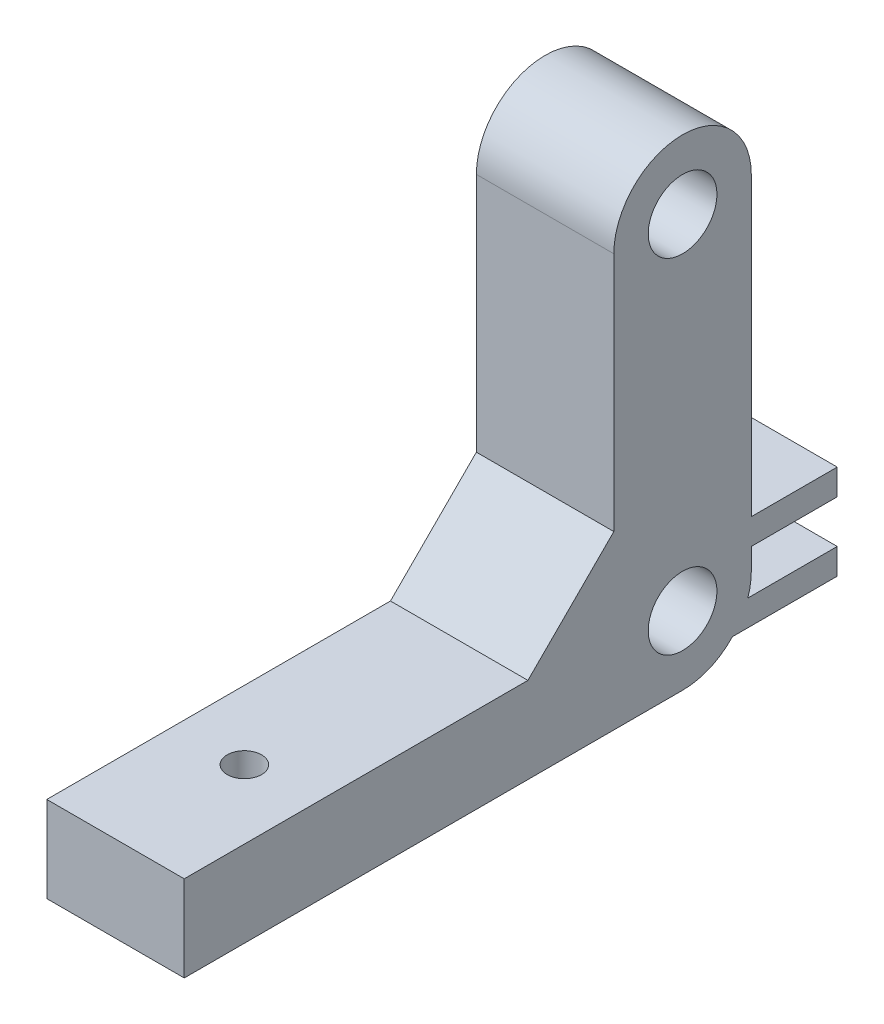
ISO-10303-21;
HEADER;
FILE_DESCRIPTION(('STEP AP214'),'2;1');
FILE_NAME('part.step','',(''),(''),'','','');
FILE_SCHEMA(('AUTOMOTIVE_DESIGN { 1 0 10303 214 1 1 1 1 }'));
ENDSEC;
DATA;
#1=APPLICATION_CONTEXT('core data for automotive mechanical design processes');
#2=APPLICATION_PROTOCOL_DEFINITION('international standard','automotive_design',2000,#1);
#3=PRODUCT_CONTEXT('',#1,'mechanical');
#4=PRODUCT('Part','Part','',(#3));
#5=PRODUCT_RELATED_PRODUCT_CATEGORY('part','',(#4));
#6=PRODUCT_DEFINITION_FORMATION('','',#4);
#7=PRODUCT_DEFINITION_CONTEXT('part definition',#1,'design');
#8=PRODUCT_DEFINITION('design','',#6,#7);
#9=PRODUCT_DEFINITION_SHAPE('','',#8);
#10=(LENGTH_UNIT() NAMED_UNIT(*) SI_UNIT(.MILLI.,.METRE.));
#11=(NAMED_UNIT(*) PLANE_ANGLE_UNIT() SI_UNIT($,.RADIAN.));
#12=(NAMED_UNIT(*) SI_UNIT($,.STERADIAN.) SOLID_ANGLE_UNIT());
#13=UNCERTAINTY_MEASURE_WITH_UNIT(LENGTH_MEASURE(1.E-05),#10,'distance_accuracy_value','');
#14=(GEOMETRIC_REPRESENTATION_CONTEXT(3) GLOBAL_UNCERTAINTY_ASSIGNED_CONTEXT((#13)) GLOBAL_UNIT_ASSIGNED_CONTEXT((#10,
#11,#12)) REPRESENTATION_CONTEXT('',''));
#15=CARTESIAN_POINT('',(0.,0.,0.));
#16=DIRECTION('',(0.,0.,1.));
#17=DIRECTION('',(1.,0.,0.));
#18=AXIS2_PLACEMENT_3D('',#15,#16,#17);
#19=CARTESIAN_POINT('',(-16.,-50.7898519823324,0.982376520731033));
#20=DIRECTION('',(1.,0.,0.));
#21=DIRECTION('',(0.,0.,-1.));
#22=AXIS2_PLACEMENT_3D('',#19,#20,#21);
#23=CYLINDRICAL_SURFACE('',#22,8.);
#24=CARTESIAN_POINT('',(0.,-50.7898519823324,0.982376520731033));
#25=DIRECTION('',(1.,0.,0.));
#26=DIRECTION('',(0.,0.,-1.));
#27=AXIS2_PLACEMENT_3D('',#24,#25,#26);
#28=CIRCLE('',#27,8.);
#29=CARTESIAN_POINT('',(0.,-58.7898519823324,0.982376520731033));
#30=VERTEX_POINT('',#29);
#31=CARTESIAN_POINT('',(0.,-56.2898519823324,-4.82709849858009));
#32=VERTEX_POINT('',#31);
#33=EDGE_CURVE('E179',#30,#32,#28,.T.);
#34=ORIENTED_EDGE('',*,*,#33,.F.);
#35=DIRECTION('',(1.,0.,0.));
#36=VECTOR('',#35,1.);
#37=CARTESIAN_POINT('',(-16.,-58.7898519823324,0.982376520731033));
#38=LINE('',#37,#36);
#39=CARTESIAN_POINT('',(-16.,-58.7898519823324,0.982376520731033));
#40=VERTEX_POINT('',#39);
#41=EDGE_CURVE('E11',#40,#30,#38,.T.);
#42=ORIENTED_EDGE('',*,*,#41,.F.);
#43=CARTESIAN_POINT('',(-16.,-50.7898519823324,0.982376520731033));
#44=DIRECTION('',(1.,0.,0.));
#45=DIRECTION('',(0.,0.,-1.));
#46=AXIS2_PLACEMENT_3D('',#43,#44,#45);
#47=CIRCLE('',#46,8.);
#48=CARTESIAN_POINT('',(-16.,-56.2898519823324,-4.82709849858009));
#49=VERTEX_POINT('',#48);
#50=EDGE_CURVE('E222',#40,#49,#47,.T.);
#51=ORIENTED_EDGE('',*,*,#50,.T.);
#52=DIRECTION('',(1.,0.,0.));
#53=VECTOR('',#52,1.);
#54=CARTESIAN_POINT('',(-16.,-56.2898519823324,-4.82709849858009));
#55=LINE('',#54,#53);
#56=EDGE_CURVE('E110',#49,#32,#55,.T.);
#57=ORIENTED_EDGE('',*,*,#56,.T.);
#58=EDGE_LOOP('',(#34,#42,#51,#57));
#59=FACE_BOUND('',#58,.T.);
#60=ADVANCED_FACE('F33',(#59),#23,.T.);
#61=CARTESIAN_POINT('',(-16.,-58.7898519823324,10.3090884514242));
#62=DIRECTION('',(0.,-1.,0.));
#63=DIRECTION('',(0.,0.,-1.));
#64=AXIS2_PLACEMENT_3D('',#61,#62,#63);
#65=PLANE('',#64);
#66=CARTESIAN_POINT('',(-8.,-58.7898519823324,43.982376520731));
#67=DIRECTION('',(0.,1.,0.));
#68=DIRECTION('',(0.,0.,1.));
#69=AXIS2_PLACEMENT_3D('',#66,#67,#68);
#70=CIRCLE('',#69,2.);
#71=CARTESIAN_POINT('',(-8.,-58.7898519823324,45.982376520731));
#72=VERTEX_POINT('',#71);
#73=EDGE_CURVE('E302',#72,#72,#70,.T.);
#74=ORIENTED_EDGE('',*,*,#73,.T.);
#75=EDGE_LOOP('',(#74));
#76=FACE_BOUND('',#75,.T.);
#77=DIRECTION('',(0.,0.,-1.));
#78=VECTOR('',#77,1.);
#79=CARTESIAN_POINT('',(0.,-58.7898519823324,10.3090884514242));
#80=LINE('',#79,#78);
#81=CARTESIAN_POINT('',(0.,-58.7898519823324,58.982376520731));
#82=VERTEX_POINT('',#81);
#83=EDGE_CURVE('E100',#82,#30,#80,.T.);
#84=ORIENTED_EDGE('',*,*,#83,.F.);
#85=DIRECTION('',(1.,0.,0.));
#86=VECTOR('',#85,1.);
#87=CARTESIAN_POINT('',(-16.,-58.7898519823324,58.982376520731));
#88=LINE('',#87,#86);
#89=CARTESIAN_POINT('',(-16.,-58.7898519823324,58.982376520731));
#90=VERTEX_POINT('',#89);
#91=EDGE_CURVE('E42',#90,#82,#88,.T.);
#92=ORIENTED_EDGE('',*,*,#91,.F.);
#93=DIRECTION('',(0.,0.,-1.));
#94=VECTOR('',#93,1.);
#95=CARTESIAN_POINT('',(-16.,-58.7898519823324,10.3090884514242));
#96=LINE('',#95,#94);
#97=EDGE_CURVE('E50',#90,#40,#96,.T.);
#98=ORIENTED_EDGE('',*,*,#97,.T.);
#99=ORIENTED_EDGE('',*,*,#41,.T.);
#100=EDGE_LOOP('',(#84,#92,#98,#99));
#101=FACE_BOUND('',#100,.T.);
#102=ADVANCED_FACE('F337',(#76,#101),#65,.T.);
#103=CARTESIAN_POINT('',(-16.,-58.7898519823324,58.982376520731));
#104=DIRECTION('',(0.,0.,1.));
#105=DIRECTION('',(1.,0.,0.));
#106=AXIS2_PLACEMENT_3D('',#103,#104,#105);
#107=PLANE('',#106);
#108=DIRECTION('',(0.,-1.,0.));
#109=VECTOR('',#108,1.);
#110=CARTESIAN_POINT('',(0.,-58.7898519823324,58.982376520731));
#111=LINE('',#110,#109);
#112=CARTESIAN_POINT('',(0.,-48.7898519823324,58.982376520731));
#113=VERTEX_POINT('',#112);
#114=EDGE_CURVE('E156',#113,#82,#111,.T.);
#115=ORIENTED_EDGE('',*,*,#114,.F.);
#116=DIRECTION('',(1.,0.,0.));
#117=VECTOR('',#116,1.);
#118=CARTESIAN_POINT('',(-16.,-48.7898519823324,58.982376520731));
#119=LINE('',#118,#117);
#120=CARTESIAN_POINT('',(-16.,-48.7898519823324,58.982376520731));
#121=VERTEX_POINT('',#120);
#122=EDGE_CURVE('E151',#121,#113,#119,.T.);
#123=ORIENTED_EDGE('',*,*,#122,.F.);
#124=DIRECTION('',(0.,-1.,0.));
#125=VECTOR('',#124,1.);
#126=CARTESIAN_POINT('',(-16.,-58.7898519823324,58.982376520731));
#127=LINE('',#126,#125);
#128=EDGE_CURVE('E154',#121,#90,#127,.T.);
#129=ORIENTED_EDGE('',*,*,#128,.T.);
#130=ORIENTED_EDGE('',*,*,#91,.T.);
#131=EDGE_LOOP('',(#115,#123,#129,#130));
#132=FACE_BOUND('',#131,.T.);
#133=ADVANCED_FACE('F153',(#132),#107,.T.);
#134=CARTESIAN_POINT('',(-16.,-48.7898519823324,58.982376520731));
#135=DIRECTION('',(0.,1.,0.));
#136=DIRECTION('',(0.,0.,1.));
#137=AXIS2_PLACEMENT_3D('',#134,#135,#136);
#138=PLANE('',#137);
#139=CARTESIAN_POINT('',(-8.,-48.7898519823324,43.982376520731));
#140=DIRECTION('',(0.,1.,0.));
#141=DIRECTION('',(0.,0.,1.));
#142=AXIS2_PLACEMENT_3D('',#139,#140,#141);
#143=CIRCLE('',#142,2.);
#144=CARTESIAN_POINT('',(-8.,-48.7898519823324,45.982376520731));
#145=VERTEX_POINT('',#144);
#146=EDGE_CURVE('E305',#145,#145,#143,.T.);
#147=ORIENTED_EDGE('',*,*,#146,.F.);
#148=EDGE_LOOP('',(#147));
#149=FACE_BOUND('',#148,.T.);
#150=DIRECTION('',(0.,0.,1.));
#151=VECTOR('',#150,1.);
#152=CARTESIAN_POINT('',(0.,-48.7898519823324,58.982376520731));
#153=LINE('',#152,#151);
#154=CARTESIAN_POINT('',(0.,-48.7898519823324,18.982376520731));
#155=VERTEX_POINT('',#154);
#156=EDGE_CURVE('E219',#155,#113,#153,.T.);
#157=ORIENTED_EDGE('',*,*,#156,.F.);
#158=DIRECTION('',(1.,0.,0.));
#159=VECTOR('',#158,1.);
#160=CARTESIAN_POINT('',(-16.,-48.7898519823324,18.982376520731));
#161=LINE('',#160,#159);
#162=CARTESIAN_POINT('',(-16.,-48.7898519823324,18.982376520731));
#163=VERTEX_POINT('',#162);
#164=EDGE_CURVE('E161',#163,#155,#161,.T.);
#165=ORIENTED_EDGE('',*,*,#164,.F.);
#166=DIRECTION('',(0.,0.,1.));
#167=VECTOR('',#166,1.);
#168=CARTESIAN_POINT('',(-16.,-48.7898519823324,58.982376520731));
#169=LINE('',#168,#167);
#170=EDGE_CURVE('E168',#163,#121,#169,.T.);
#171=ORIENTED_EDGE('',*,*,#170,.T.);
#172=ORIENTED_EDGE('',*,*,#122,.T.);
#173=EDGE_LOOP('',(#157,#165,#171,#172));
#174=FACE_BOUND('',#173,.T.);
#175=ADVANCED_FACE('F171',(#149,#174),#138,.T.);
#176=CARTESIAN_POINT('',(-16.,-38.7898519823324,8.98237652073104));
#177=DIRECTION('',(0.,0.707106781186547,0.707106781186548));
#178=DIRECTION('',(0.,-0.707106781186548,0.707106781186547));
#179=AXIS2_PLACEMENT_3D('',#176,#177,#178);
#180=PLANE('',#179);
#181=DIRECTION('',(0.,-0.707106781186548,0.707106781186547));
#182=VECTOR('',#181,1.);
#183=CARTESIAN_POINT('',(0.,-38.7898519823324,8.98237652073104));
#184=LINE('',#183,#182);
#185=CARTESIAN_POINT('',(0.,-38.7898519823324,8.98237652073104));
#186=VERTEX_POINT('',#185);
#187=EDGE_CURVE('E216',#186,#155,#184,.T.);
#188=ORIENTED_EDGE('',*,*,#187,.F.);
#189=DIRECTION('',(1.,0.,0.));
#190=VECTOR('',#189,1.);
#191=CARTESIAN_POINT('',(-16.,-38.7898519823324,8.98237652073104));
#192=LINE('',#191,#190);
#193=CARTESIAN_POINT('',(-16.,-38.7898519823324,8.98237652073104));
#194=VERTEX_POINT('',#193);
#195=EDGE_CURVE('E226',#194,#186,#192,.T.);
#196=ORIENTED_EDGE('',*,*,#195,.F.);
#197=DIRECTION('',(0.,-0.707106781186548,0.707106781186547));
#198=VECTOR('',#197,1.);
#199=CARTESIAN_POINT('',(-16.,-38.7898519823324,8.98237652073104));
#200=LINE('',#199,#198);
#201=EDGE_CURVE('E172',#194,#163,#200,.T.);
#202=ORIENTED_EDGE('',*,*,#201,.T.);
#203=ORIENTED_EDGE('',*,*,#164,.T.);
#204=EDGE_LOOP('',(#188,#196,#202,#203));
#205=FACE_BOUND('',#204,.T.);
#206=ADVANCED_FACE('F256',(#205),#180,.T.);
#207=CARTESIAN_POINT('',(-16.,-10.7898519823324,8.98237652073104));
#208=DIRECTION('',(0.,0.,1.));
#209=DIRECTION('',(0.,-1.,0.));
#210=AXIS2_PLACEMENT_3D('',#207,#208,#209);
#211=PLANE('',#210);
#212=DIRECTION('',(0.,-1.,0.));
#213=VECTOR('',#212,1.);
#214=CARTESIAN_POINT('',(0.,-10.7898519823324,8.98237652073104));
#215=LINE('',#214,#213);
#216=CARTESIAN_POINT('',(0.,-10.7898519823324,8.98237652073104));
#217=VERTEX_POINT('',#216);
#218=EDGE_CURVE('E213',#217,#186,#215,.T.);
#219=ORIENTED_EDGE('',*,*,#218,.F.);
#220=DIRECTION('',(1.,0.,0.));
#221=VECTOR('',#220,1.);
#222=CARTESIAN_POINT('',(-16.,-10.7898519823324,8.98237652073104));
#223=LINE('',#222,#221);
#224=CARTESIAN_POINT('',(-16.,-10.7898519823324,8.98237652073104));
#225=VERTEX_POINT('',#224);
#226=EDGE_CURVE('E228',#225,#217,#223,.T.);
#227=ORIENTED_EDGE('',*,*,#226,.F.);
#228=DIRECTION('',(0.,-1.,0.));
#229=VECTOR('',#228,1.);
#230=CARTESIAN_POINT('',(-16.,-10.7898519823324,8.98237652073104));
#231=LINE('',#230,#229);
#232=EDGE_CURVE('E174',#225,#194,#231,.T.);
#233=ORIENTED_EDGE('',*,*,#232,.T.);
#234=ORIENTED_EDGE('',*,*,#195,.T.);
#235=EDGE_LOOP('',(#219,#227,#233,#234));
#236=FACE_BOUND('',#235,.T.);
#237=ADVANCED_FACE('F262',(#236),#211,.T.);
#238=CARTESIAN_POINT('',(-16.,-10.7898519823324,0.982376520731038));
#239=DIRECTION('',(1.,0.,0.));
#240=DIRECTION('',(0.,0.,-1.));
#241=AXIS2_PLACEMENT_3D('',#238,#239,#240);
#242=CYLINDRICAL_SURFACE('',#241,8.);
#243=CARTESIAN_POINT('',(0.,-10.7898519823324,0.982376520731038));
#244=DIRECTION('',(1.,0.,0.));
#245=DIRECTION('',(0.,0.,1.));
#246=AXIS2_PLACEMENT_3D('',#243,#244,#245);
#247=CIRCLE('',#246,8.);
#248=CARTESIAN_POINT('',(0.,-10.7898519823324,-7.01762347926896));
#249=VERTEX_POINT('',#248);
#250=EDGE_CURVE('E210',#249,#217,#247,.T.);
#251=ORIENTED_EDGE('',*,*,#250,.F.);
#252=DIRECTION('',(1.,0.,0.));
#253=VECTOR('',#252,1.);
#254=CARTESIAN_POINT('',(-16.,-10.7898519823324,-7.01762347926896));
#255=LINE('',#254,#253);
#256=CARTESIAN_POINT('',(-16.,-10.7898519823324,-7.01762347926896));
#257=VERTEX_POINT('',#256);
#258=EDGE_CURVE('E230',#257,#249,#255,.T.);
#259=ORIENTED_EDGE('',*,*,#258,.F.);
#260=CARTESIAN_POINT('',(-16.,-10.7898519823324,0.982376520731038));
#261=DIRECTION('',(1.,0.,0.));
#262=DIRECTION('',(0.,0.,1.));
#263=AXIS2_PLACEMENT_3D('',#260,#261,#262);
#264=CIRCLE('',#263,8.);
#265=EDGE_CURVE('E263',#257,#225,#264,.T.);
#266=ORIENTED_EDGE('',*,*,#265,.T.);
#267=ORIENTED_EDGE('',*,*,#226,.T.);
#268=EDGE_LOOP('',(#251,#259,#266,#267));
#269=FACE_BOUND('',#268,.T.);
#270=ADVANCED_FACE('F356',(#269),#242,.T.);
#271=CARTESIAN_POINT('',(-16.,-10.7898519823324,-7.01762347926896));
#272=DIRECTION('',(0.,0.,-1.));
#273=DIRECTION('',(0.,1.,0.));
#274=AXIS2_PLACEMENT_3D('',#271,#272,#273);
#275=PLANE('',#274);
#276=DIRECTION('',(0.,1.,0.));
#277=VECTOR('',#276,1.);
#278=CARTESIAN_POINT('',(0.,-10.7898519823324,-7.01762347926896));
#279=LINE('',#278,#277);
#280=CARTESIAN_POINT('',(0.,-45.2898519823324,-7.01762347926897));
#281=VERTEX_POINT('',#280);
#282=EDGE_CURVE('E207',#281,#249,#279,.T.);
#283=ORIENTED_EDGE('',*,*,#282,.F.);
#284=DIRECTION('',(1.,0.,0.));
#285=VECTOR('',#284,1.);
#286=CARTESIAN_POINT('',(-16.,-45.2898519823324,-7.01762347926897));
#287=LINE('',#286,#285);
#288=CARTESIAN_POINT('',(-16.,-45.2898519823324,-7.01762347926897));
#289=VERTEX_POINT('',#288);
#290=EDGE_CURVE('E232',#289,#281,#287,.T.);
#291=ORIENTED_EDGE('',*,*,#290,.F.);
#292=DIRECTION('',(0.,1.,0.));
#293=VECTOR('',#292,1.);
#294=CARTESIAN_POINT('',(-16.,-10.7898519823324,-7.01762347926896));
#295=LINE('',#294,#293);
#296=EDGE_CURVE('E264',#289,#257,#295,.T.);
#297=ORIENTED_EDGE('',*,*,#296,.T.);
#298=ORIENTED_EDGE('',*,*,#258,.T.);
#299=EDGE_LOOP('',(#283,#291,#297,#298));
#300=FACE_BOUND('',#299,.T.);
#301=ADVANCED_FACE('F359',(#300),#275,.T.);
#302=CARTESIAN_POINT('',(-16.,-45.2898519823324,-7.01762347926897));
#303=DIRECTION('',(0.,1.,0.));
#304=DIRECTION('',(0.,0.,1.));
#305=AXIS2_PLACEMENT_3D('',#302,#303,#304);
#306=PLANE('',#305);
#307=CARTESIAN_POINT('',(-8.,-45.2898519823324,-12.017623479269));
#308=DIRECTION('',(0.,1.,0.));
#309=DIRECTION('',(0.,0.,1.));
#310=AXIS2_PLACEMENT_3D('',#307,#308,#309);
#311=CIRCLE('',#310,1.5);
#312=CARTESIAN_POINT('',(-8.,-45.2898519823324,-10.517623479269));
#313=VERTEX_POINT('',#312);
#314=EDGE_CURVE('E316',#313,#313,#311,.T.);
#315=ORIENTED_EDGE('',*,*,#314,.F.);
#316=EDGE_LOOP('',(#315));
#317=FACE_BOUND('',#316,.T.);
#318=DIRECTION('',(0.,0.,1.));
#319=VECTOR('',#318,1.);
#320=CARTESIAN_POINT('',(0.,-45.2898519823324,-7.01762347926897));
#321=LINE('',#320,#319);
#322=CARTESIAN_POINT('',(0.,-45.2898519823324,-17.017623479269));
#323=VERTEX_POINT('',#322);
#324=EDGE_CURVE('E204',#323,#281,#321,.T.);
#325=ORIENTED_EDGE('',*,*,#324,.F.);
#326=DIRECTION('',(1.,0.,0.));
#327=VECTOR('',#326,1.);
#328=CARTESIAN_POINT('',(-16.,-45.2898519823324,-17.017623479269));
#329=LINE('',#328,#327);
#330=CARTESIAN_POINT('',(-16.,-45.2898519823324,-17.017623479269));
#331=VERTEX_POINT('',#330);
#332=EDGE_CURVE('E234',#331,#323,#329,.T.);
#333=ORIENTED_EDGE('',*,*,#332,.F.);
#334=DIRECTION('',(0.,0.,1.));
#335=VECTOR('',#334,1.);
#336=CARTESIAN_POINT('',(-16.,-45.2898519823324,-7.01762347926897));
#337=LINE('',#336,#335);
#338=EDGE_CURVE('E269',#331,#289,#337,.T.);
#339=ORIENTED_EDGE('',*,*,#338,.T.);
#340=ORIENTED_EDGE('',*,*,#290,.T.);
#341=EDGE_LOOP('',(#325,#333,#339,#340));
#342=FACE_BOUND('',#341,.T.);
#343=ADVANCED_FACE('F363',(#317,#342),#306,.T.);
#344=CARTESIAN_POINT('',(-16.,-45.2898519823324,-17.017623479269));
#345=DIRECTION('',(0.,0.,-1.));
#346=DIRECTION('',(-1.,0.,0.));
#347=AXIS2_PLACEMENT_3D('',#344,#345,#346);
#348=PLANE('',#347);
#349=DIRECTION('',(0.,1.,0.));
#350=VECTOR('',#349,1.);
#351=CARTESIAN_POINT('',(0.,-45.2898519823324,-17.017623479269));
#352=LINE('',#351,#350);
#353=CARTESIAN_POINT('',(0.,-48.2898519823324,-17.017623479269));
#354=VERTEX_POINT('',#353);
#355=EDGE_CURVE('E201',#354,#323,#352,.T.);
#356=ORIENTED_EDGE('',*,*,#355,.F.);
#357=DIRECTION('',(1.,0.,0.));
#358=VECTOR('',#357,1.);
#359=CARTESIAN_POINT('',(-16.,-48.2898519823324,-17.017623479269));
#360=LINE('',#359,#358);
#361=CARTESIAN_POINT('',(-16.,-48.2898519823324,-17.017623479269));
#362=VERTEX_POINT('',#361);
#363=EDGE_CURVE('E236',#362,#354,#360,.T.);
#364=ORIENTED_EDGE('',*,*,#363,.F.);
#365=DIRECTION('',(0.,1.,0.));
#366=VECTOR('',#365,1.);
#367=CARTESIAN_POINT('',(-16.,-45.2898519823324,-17.017623479269));
#368=LINE('',#367,#366);
#369=EDGE_CURVE('E272',#362,#331,#368,.T.);
#370=ORIENTED_EDGE('',*,*,#369,.T.);
#371=ORIENTED_EDGE('',*,*,#332,.T.);
#372=EDGE_LOOP('',(#356,#364,#370,#371));
#373=FACE_BOUND('',#372,.T.);
#374=ADVANCED_FACE('F367',(#373),#348,.T.);
#375=CARTESIAN_POINT('',(-16.,-48.2898519823324,-17.017623479269));
#376=DIRECTION('',(0.,-1.,0.));
#377=DIRECTION('',(0.,0.,-1.));
#378=AXIS2_PLACEMENT_3D('',#375,#376,#377);
#379=PLANE('',#378);
#380=CARTESIAN_POINT('',(-8.,-48.2898519823324,-12.017623479269));
#381=DIRECTION('',(0.,-1.,0.));
#382=DIRECTION('',(0.,0.,-1.));
#383=AXIS2_PLACEMENT_3D('',#380,#381,#382);
#384=CIRCLE('',#383,1.5);
#385=CARTESIAN_POINT('',(-8.,-48.2898519823324,-13.517623479269));
#386=VERTEX_POINT('',#385);
#387=EDGE_CURVE('E308',#386,#386,#384,.T.);
#388=ORIENTED_EDGE('',*,*,#387,.F.);
#389=EDGE_LOOP('',(#388));
#390=FACE_BOUND('',#389,.T.);
#391=DIRECTION('',(0.,0.,-1.));
#392=VECTOR('',#391,1.);
#393=CARTESIAN_POINT('',(0.,-48.2898519823324,-17.017623479269));
#394=LINE('',#393,#392);
#395=CARTESIAN_POINT('',(0.,-48.2898519823324,-7.01762347926897));
#396=VERTEX_POINT('',#395);
#397=EDGE_CURVE('E198',#396,#354,#394,.T.);
#398=ORIENTED_EDGE('',*,*,#397,.F.);
#399=DIRECTION('',(1.,0.,0.));
#400=VECTOR('',#399,1.);
#401=CARTESIAN_POINT('',(-16.,-48.2898519823324,-7.01762347926897));
#402=LINE('',#401,#400);
#403=CARTESIAN_POINT('',(-16.,-48.2898519823324,-7.01762347926897));
#404=VERTEX_POINT('',#403);
#405=EDGE_CURVE('E238',#404,#396,#402,.T.);
#406=ORIENTED_EDGE('',*,*,#405,.F.);
#407=DIRECTION('',(0.,0.,-1.));
#408=VECTOR('',#407,1.);
#409=CARTESIAN_POINT('',(-16.,-48.2898519823324,-17.017623479269));
#410=LINE('',#409,#408);
#411=EDGE_CURVE('E275',#404,#362,#410,.T.);
#412=ORIENTED_EDGE('',*,*,#411,.T.);
#413=ORIENTED_EDGE('',*,*,#363,.T.);
#414=EDGE_LOOP('',(#398,#406,#412,#413));
#415=FACE_BOUND('',#414,.T.);
#416=ADVANCED_FACE('F371',(#390,#415),#379,.T.);
#417=CARTESIAN_POINT('',(-16.,-48.2898519823324,-7.01762347926897));
#418=DIRECTION('',(0.,0.,-1.));
#419=DIRECTION('',(-1.,0.,0.));
#420=AXIS2_PLACEMENT_3D('',#417,#418,#419);
#421=PLANE('',#420);
#422=DIRECTION('',(0.,1.,0.));
#423=VECTOR('',#422,1.);
#424=CARTESIAN_POINT('',(0.,-48.2898519823324,-7.01762347926897));
#425=LINE('',#424,#423);
#426=CARTESIAN_POINT('',(0.,-50.7898519823324,-7.01762347926897));
#427=VERTEX_POINT('',#426);
#428=EDGE_CURVE('E195',#427,#396,#425,.T.);
#429=ORIENTED_EDGE('',*,*,#428,.F.);
#430=DIRECTION('',(1.,0.,0.));
#431=VECTOR('',#430,1.);
#432=CARTESIAN_POINT('',(-16.,-50.7898519823324,-7.01762347926897));
#433=LINE('',#432,#431);
#434=CARTESIAN_POINT('',(-16.,-50.7898519823324,-7.01762347926897));
#435=VERTEX_POINT('',#434);
#436=EDGE_CURVE('E240',#435,#427,#433,.T.);
#437=ORIENTED_EDGE('',*,*,#436,.F.);
#438=DIRECTION('',(0.,1.,0.));
#439=VECTOR('',#438,1.);
#440=CARTESIAN_POINT('',(-16.,-48.2898519823324,-7.01762347926897));
#441=LINE('',#440,#439);
#442=EDGE_CURVE('E278',#435,#404,#441,.T.);
#443=ORIENTED_EDGE('',*,*,#442,.T.);
#444=ORIENTED_EDGE('',*,*,#405,.T.);
#445=EDGE_LOOP('',(#429,#437,#443,#444));
#446=FACE_BOUND('',#445,.T.);
#447=ADVANCED_FACE('F375',(#446),#421,.T.);
#448=CARTESIAN_POINT('',(-16.,-50.7898519823324,0.982376520731033));
#449=DIRECTION('',(1.,0.,0.));
#450=DIRECTION('',(0.,0.,-1.));
#451=AXIS2_PLACEMENT_3D('',#448,#449,#450);
#452=CYLINDRICAL_SURFACE('',#451,8.);
#453=CARTESIAN_POINT('',(0.,-50.7898519823324,0.982376520731033));
#454=DIRECTION('',(1.,0.,0.));
#455=DIRECTION('',(0.,0.,-1.));
#456=AXIS2_PLACEMENT_3D('',#453,#454,#455);
#457=CIRCLE('',#456,8.);
#458=CARTESIAN_POINT('',(0.,-53.2898519823324,-6.6169655560543));
#459=VERTEX_POINT('',#458);
#460=EDGE_CURVE('E192',#459,#427,#457,.T.);
#461=ORIENTED_EDGE('',*,*,#460,.F.);
#462=DIRECTION('',(1.,0.,0.));
#463=VECTOR('',#462,1.);
#464=CARTESIAN_POINT('',(-16.,-53.2898519823324,-6.6169655560543));
#465=LINE('',#464,#463);
#466=CARTESIAN_POINT('',(-16.,-53.2898519823324,-6.6169655560543));
#467=VERTEX_POINT('',#466);
#468=EDGE_CURVE('E242',#467,#459,#465,.T.);
#469=ORIENTED_EDGE('',*,*,#468,.F.);
#470=CARTESIAN_POINT('',(-16.,-50.7898519823324,0.982376520731033));
#471=DIRECTION('',(1.,0.,0.));
#472=DIRECTION('',(0.,0.,-1.));
#473=AXIS2_PLACEMENT_3D('',#470,#471,#472);
#474=CIRCLE('',#473,8.);
#475=EDGE_CURVE('E281',#467,#435,#474,.T.);
#476=ORIENTED_EDGE('',*,*,#475,.T.);
#477=ORIENTED_EDGE('',*,*,#436,.T.);
#478=EDGE_LOOP('',(#461,#469,#476,#477));
#479=FACE_BOUND('',#478,.T.);
#480=ADVANCED_FACE('F379',(#479),#452,.T.);
#481=CARTESIAN_POINT('',(-16.,-53.2898519823324,-17.017623479269));
#482=DIRECTION('',(0.,1.,0.));
#483=DIRECTION('',(0.,0.,1.));
#484=AXIS2_PLACEMENT_3D('',#481,#482,#483);
#485=PLANE('',#484);
#486=CARTESIAN_POINT('',(-8.,-53.2898519823324,-12.017623479269));
#487=DIRECTION('',(0.,1.,0.));
#488=DIRECTION('',(0.,0.,1.));
#489=AXIS2_PLACEMENT_3D('',#486,#487,#488);
#490=CIRCLE('',#489,1.5);
#491=CARTESIAN_POINT('',(-8.,-53.2898519823324,-10.517623479269));
#492=VERTEX_POINT('',#491);
#493=EDGE_CURVE('E313',#492,#492,#490,.T.);
#494=ORIENTED_EDGE('',*,*,#493,.F.);
#495=EDGE_LOOP('',(#494));
#496=FACE_BOUND('',#495,.T.);
#497=DIRECTION('',(0.,0.,1.));
#498=VECTOR('',#497,1.);
#499=CARTESIAN_POINT('',(0.,-53.2898519823324,-17.017623479269));
#500=LINE('',#499,#498);
#501=CARTESIAN_POINT('',(0.,-53.2898519823324,-17.017623479269));
#502=VERTEX_POINT('',#501);
#503=EDGE_CURVE('E189',#502,#459,#500,.T.);
#504=ORIENTED_EDGE('',*,*,#503,.F.);
#505=DIRECTION('',(1.,0.,0.));
#506=VECTOR('',#505,1.);
#507=CARTESIAN_POINT('',(-16.,-53.2898519823324,-17.017623479269));
#508=LINE('',#507,#506);
#509=CARTESIAN_POINT('',(-16.,-53.2898519823324,-17.017623479269));
#510=VERTEX_POINT('',#509);
#511=EDGE_CURVE('E244',#510,#502,#508,.T.);
#512=ORIENTED_EDGE('',*,*,#511,.F.);
#513=DIRECTION('',(0.,0.,1.));
#514=VECTOR('',#513,1.);
#515=CARTESIAN_POINT('',(-16.,-53.2898519823324,-17.017623479269));
#516=LINE('',#515,#514);
#517=EDGE_CURVE('E284',#510,#467,#516,.T.);
#518=ORIENTED_EDGE('',*,*,#517,.T.);
#519=ORIENTED_EDGE('',*,*,#468,.T.);
#520=EDGE_LOOP('',(#504,#512,#518,#519));
#521=FACE_BOUND('',#520,.T.);
#522=ADVANCED_FACE('F333',(#496,#521),#485,.T.);
#523=CARTESIAN_POINT('',(-16.,-56.2898519823324,-17.017623479269));
#524=DIRECTION('',(0.,0.,-1.));
#525=DIRECTION('',(-1.,0.,0.));
#526=AXIS2_PLACEMENT_3D('',#523,#524,#525);
#527=PLANE('',#526);
#528=DIRECTION('',(0.,1.,0.));
#529=VECTOR('',#528,1.);
#530=CARTESIAN_POINT('',(0.,-56.2898519823324,-17.017623479269));
#531=LINE('',#530,#529);
#532=CARTESIAN_POINT('',(0.,-56.2898519823324,-17.017623479269));
#533=VERTEX_POINT('',#532);
#534=EDGE_CURVE('E186',#533,#502,#531,.T.);
#535=ORIENTED_EDGE('',*,*,#534,.F.);
#536=DIRECTION('',(1.,0.,0.));
#537=VECTOR('',#536,1.);
#538=CARTESIAN_POINT('',(-16.,-56.2898519823324,-17.017623479269));
#539=LINE('',#538,#537);
#540=CARTESIAN_POINT('',(-16.,-56.2898519823324,-17.017623479269));
#541=VERTEX_POINT('',#540);
#542=EDGE_CURVE('E246',#541,#533,#539,.T.);
#543=ORIENTED_EDGE('',*,*,#542,.F.);
#544=DIRECTION('',(0.,1.,0.));
#545=VECTOR('',#544,1.);
#546=CARTESIAN_POINT('',(-16.,-56.2898519823324,-17.017623479269));
#547=LINE('',#546,#545);
#548=EDGE_CURVE('E287',#541,#510,#547,.T.);
#549=ORIENTED_EDGE('',*,*,#548,.T.);
#550=ORIENTED_EDGE('',*,*,#511,.T.);
#551=EDGE_LOOP('',(#535,#543,#549,#550));
#552=FACE_BOUND('',#551,.T.);
#553=ADVANCED_FACE('F326',(#552),#527,.T.);
#554=CARTESIAN_POINT('',(-16.,-56.2898519823324,-4.82709849858009));
#555=DIRECTION('',(0.,-1.,0.));
#556=DIRECTION('',(0.,0.,-1.));
#557=AXIS2_PLACEMENT_3D('',#554,#555,#556);
#558=PLANE('',#557);
#559=CARTESIAN_POINT('',(-8.,-56.2898519823324,-12.017623479269));
#560=DIRECTION('',(0.,-1.,0.));
#561=DIRECTION('',(0.,0.,-1.));
#562=AXIS2_PLACEMENT_3D('',#559,#560,#561);
#563=CIRCLE('',#562,1.5);
#564=CARTESIAN_POINT('',(-8.,-56.2898519823324,-13.517623479269));
#565=VERTEX_POINT('',#564);
#566=EDGE_CURVE('E36',#565,#565,#563,.T.);
#567=ORIENTED_EDGE('',*,*,#566,.F.);
#568=EDGE_LOOP('',(#567));
#569=FACE_BOUND('',#568,.T.);
#570=DIRECTION('',(0.,0.,-1.));
#571=VECTOR('',#570,1.);
#572=CARTESIAN_POINT('',(0.,-56.2898519823324,-4.82709849858009));
#573=LINE('',#572,#571);
#574=EDGE_CURVE('E182',#32,#533,#573,.T.);
#575=ORIENTED_EDGE('',*,*,#574,.F.);
#576=ORIENTED_EDGE('',*,*,#56,.F.);
#577=DIRECTION('',(0.,0.,-1.));
#578=VECTOR('',#577,1.);
#579=CARTESIAN_POINT('',(-16.,-56.2898519823324,-4.82709849858009));
#580=LINE('',#579,#578);
#581=EDGE_CURVE('E290',#49,#541,#580,.T.);
#582=ORIENTED_EDGE('',*,*,#581,.T.);
#583=ORIENTED_EDGE('',*,*,#542,.T.);
#584=EDGE_LOOP('',(#575,#576,#582,#583));
#585=FACE_BOUND('',#584,.T.);
#586=ADVANCED_FACE('F249',(#569,#585),#558,.T.);
#587=CARTESIAN_POINT('',(-16.,-50.7898519823324,0.982376520731033));
#588=DIRECTION('',(1.,0.,0.));
#589=DIRECTION('',(0.,0.,-1.));
#590=AXIS2_PLACEMENT_3D('',#587,#588,#589);
#591=PLANE('',#590);
#592=CARTESIAN_POINT('',(-16.,-50.7898519823324,0.982376520731033));
#593=DIRECTION('',(1.,0.,0.));
#594=DIRECTION('',(0.,0.,-1.));
#595=AXIS2_PLACEMENT_3D('',#592,#593,#594);
#596=CIRCLE('',#595,4.00000000000001);
#597=CARTESIAN_POINT('',(-16.,-50.7898519823324,-3.01762347926898));
#598=VERTEX_POINT('',#597);
#599=EDGE_CURVE('E296',#598,#598,#596,.T.);
#600=ORIENTED_EDGE('',*,*,#599,.T.);
#601=EDGE_LOOP('',(#600));
#602=FACE_BOUND('',#601,.T.);
#603=CARTESIAN_POINT('',(-16.,-10.7898519823324,0.982376520731038));
#604=DIRECTION('',(1.,0.,0.));
#605=DIRECTION('',(0.,0.,-1.));
#606=AXIS2_PLACEMENT_3D('',#603,#604,#605);
#607=CIRCLE('',#606,4.00000000000001);
#608=CARTESIAN_POINT('',(-16.,-10.7898519823324,-3.01762347926897));
#609=VERTEX_POINT('',#608);
#610=EDGE_CURVE('E183',#609,#609,#607,.T.);
#611=ORIENTED_EDGE('',*,*,#610,.T.);
#612=EDGE_LOOP('',(#611));
#613=FACE_BOUND('',#612,.T.);
#614=ORIENTED_EDGE('',*,*,#50,.F.);
#615=ORIENTED_EDGE('',*,*,#97,.F.);
#616=ORIENTED_EDGE('',*,*,#128,.F.);
#617=ORIENTED_EDGE('',*,*,#170,.F.);
#618=ORIENTED_EDGE('',*,*,#201,.F.);
#619=ORIENTED_EDGE('',*,*,#232,.F.);
#620=ORIENTED_EDGE('',*,*,#265,.F.);
#621=ORIENTED_EDGE('',*,*,#296,.F.);
#622=ORIENTED_EDGE('',*,*,#338,.F.);
#623=ORIENTED_EDGE('',*,*,#369,.F.);
#624=ORIENTED_EDGE('',*,*,#411,.F.);
#625=ORIENTED_EDGE('',*,*,#442,.F.);
#626=ORIENTED_EDGE('',*,*,#475,.F.);
#627=ORIENTED_EDGE('',*,*,#517,.F.);
#628=ORIENTED_EDGE('',*,*,#548,.F.);
#629=ORIENTED_EDGE('',*,*,#581,.F.);
#630=EDGE_LOOP('',(#614,#615,#616,#617,#618,#619,#620,#621,#622,#623,#624,#625,#626,#627,#628,#629));
#631=FACE_BOUND('',#630,.T.);
#632=ADVANCED_FACE('F166',(#602,#613,#631),#591,.F.);
#633=CARTESIAN_POINT('',(0.,-50.7898519823324,0.982376520731033));
#634=DIRECTION('',(1.,0.,0.));
#635=DIRECTION('',(0.,0.,-1.));
#636=AXIS2_PLACEMENT_3D('',#633,#634,#635);
#637=PLANE('',#636);
#638=CARTESIAN_POINT('',(0.,-50.7898519823324,0.982376520731033));
#639=DIRECTION('',(1.,0.,0.));
#640=DIRECTION('',(0.,0.,-1.));
#641=AXIS2_PLACEMENT_3D('',#638,#639,#640);
#642=CIRCLE('',#641,4.00000000000001);
#643=CARTESIAN_POINT('',(0.,-50.7898519823324,-3.01762347926898));
#644=VERTEX_POINT('',#643);
#645=EDGE_CURVE('E299',#644,#644,#642,.T.);
#646=ORIENTED_EDGE('',*,*,#645,.F.);
#647=EDGE_LOOP('',(#646));
#648=FACE_BOUND('',#647,.T.);
#649=CARTESIAN_POINT('',(0.,-10.7898519823324,0.982376520731038));
#650=DIRECTION('',(1.,0.,0.));
#651=DIRECTION('',(0.,0.,-1.));
#652=AXIS2_PLACEMENT_3D('',#649,#650,#651);
#653=CIRCLE('',#652,4.00000000000001);
#654=CARTESIAN_POINT('',(0.,-10.7898519823324,-3.01762347926897));
#655=VERTEX_POINT('',#654);
#656=EDGE_CURVE('E293',#655,#655,#653,.T.);
#657=ORIENTED_EDGE('',*,*,#656,.F.);
#658=EDGE_LOOP('',(#657));
#659=FACE_BOUND('',#658,.T.);
#660=ORIENTED_EDGE('',*,*,#33,.T.);
#661=ORIENTED_EDGE('',*,*,#574,.T.);
#662=ORIENTED_EDGE('',*,*,#534,.T.);
#663=ORIENTED_EDGE('',*,*,#503,.T.);
#664=ORIENTED_EDGE('',*,*,#460,.T.);
#665=ORIENTED_EDGE('',*,*,#428,.T.);
#666=ORIENTED_EDGE('',*,*,#397,.T.);
#667=ORIENTED_EDGE('',*,*,#355,.T.);
#668=ORIENTED_EDGE('',*,*,#324,.T.);
#669=ORIENTED_EDGE('',*,*,#282,.T.);
#670=ORIENTED_EDGE('',*,*,#250,.T.);
#671=ORIENTED_EDGE('',*,*,#218,.T.);
#672=ORIENTED_EDGE('',*,*,#187,.T.);
#673=ORIENTED_EDGE('',*,*,#156,.T.);
#674=ORIENTED_EDGE('',*,*,#114,.T.);
#675=ORIENTED_EDGE('',*,*,#83,.T.);
#676=EDGE_LOOP('',(#660,#661,#662,#663,#664,#665,#666,#667,#668,#669,#670,#671,#672,#673,#674,#675));
#677=FACE_BOUND('',#676,.T.);
#678=ADVANCED_FACE('F252',(#648,#659,#677),#637,.T.);
#679=CARTESIAN_POINT('',(-16.,-10.7898519823324,0.982376520731038));
#680=DIRECTION('',(1.,0.,0.));
#681=DIRECTION('',(0.,0.,-1.));
#682=AXIS2_PLACEMENT_3D('',#679,#680,#681);
#683=CYLINDRICAL_SURFACE('',#682,4.00000000000001);
#684=ORIENTED_EDGE('',*,*,#610,.F.);
#685=EDGE_LOOP('',(#684));
#686=FACE_BOUND('',#685,.T.);
#687=ORIENTED_EDGE('',*,*,#656,.T.);
#688=EDGE_LOOP('',(#687));
#689=FACE_BOUND('',#688,.T.);
#690=ADVANCED_FACE('F424',(#686,#689),#683,.F.);
#691=CARTESIAN_POINT('',(-16.,-50.7898519823324,0.982376520731033));
#692=DIRECTION('',(1.,0.,0.));
#693=DIRECTION('',(0.,0.,-1.));
#694=AXIS2_PLACEMENT_3D('',#691,#692,#693);
#695=CYLINDRICAL_SURFACE('',#694,4.00000000000001);
#696=ORIENTED_EDGE('',*,*,#599,.F.);
#697=EDGE_LOOP('',(#696));
#698=FACE_BOUND('',#697,.T.);
#699=ORIENTED_EDGE('',*,*,#645,.T.);
#700=EDGE_LOOP('',(#699));
#701=FACE_BOUND('',#700,.T.);
#702=ADVANCED_FACE('F418',(#698,#701),#695,.F.);
#703=CARTESIAN_POINT('',(-8.,-58.7898519823324,43.982376520731));
#704=DIRECTION('',(0.,1.,0.));
#705=DIRECTION('',(0.,0.,1.));
#706=AXIS2_PLACEMENT_3D('',#703,#704,#705);
#707=CYLINDRICAL_SURFACE('',#706,2.);
#708=ORIENTED_EDGE('',*,*,#73,.F.);
#709=EDGE_LOOP('',(#708));
#710=FACE_BOUND('',#709,.T.);
#711=ORIENTED_EDGE('',*,*,#146,.T.);
#712=EDGE_LOOP('',(#711));
#713=FACE_BOUND('',#712,.T.);
#714=ADVANCED_FACE('F411',(#710,#713),#707,.F.);
#715=CARTESIAN_POINT('',(-8.,-58.7898519823324,-12.017623479269));
#716=DIRECTION('',(0.,1.,0.));
#717=DIRECTION('',(0.,0.,1.));
#718=AXIS2_PLACEMENT_3D('',#715,#716,#717);
#719=CYLINDRICAL_SURFACE('',#718,1.5);
#720=ORIENTED_EDGE('',*,*,#493,.T.);
#721=EDGE_LOOP('',(#720));
#722=FACE_BOUND('',#721,.T.);
#723=ORIENTED_EDGE('',*,*,#566,.T.);
#724=EDGE_LOOP('',(#723));
#725=FACE_BOUND('',#724,.T.);
#726=ADVANCED_FACE('F323',(#722,#725),#719,.F.);
#727=ORIENTED_EDGE('',*,*,#387,.T.);
#728=EDGE_LOOP('',(#727));
#729=FACE_BOUND('',#728,.T.);
#730=ORIENTED_EDGE('',*,*,#314,.T.);
#731=EDGE_LOOP('',(#730));
#732=FACE_BOUND('',#731,.T.);
#733=ADVANCED_FACE('F410',(#729,#732),#719,.F.);
#734=CLOSED_SHELL('',(#60,#102,#133,#175,#206,#237,#270,#301,#343,#374,#416,#447,#480,#522,#553,
#586,#632,#678,#690,#702,#714,#726,#733));
#735=MANIFOLD_SOLID_BREP('B2',#734);
#736=ADVANCED_BREP_SHAPE_REPRESENTATION('',(#18,#735),#14);
#737=SHAPE_DEFINITION_REPRESENTATION(#9,#736);
ENDSEC;
END-ISO-10303-21;
